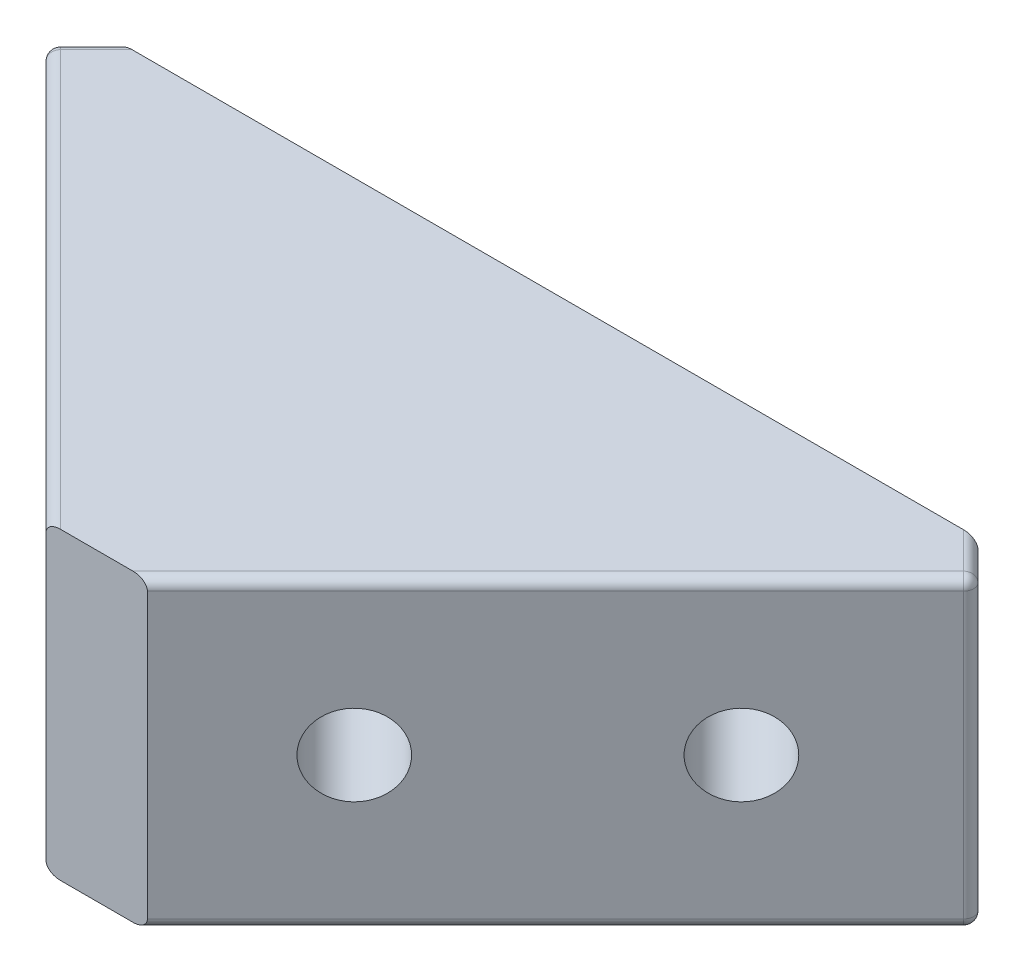
ISO-10303-21;
HEADER;
FILE_DESCRIPTION(('STEP AP214'),'2;1');
FILE_NAME('part.step','',(''),(''),'','','');
FILE_SCHEMA(('AUTOMOTIVE_DESIGN { 1 0 10303 214 1 1 1 1 }'));
ENDSEC;
DATA;
#1=APPLICATION_CONTEXT('core data for automotive mechanical design processes');
#2=APPLICATION_PROTOCOL_DEFINITION('international standard','automotive_design',2000,#1);
#3=PRODUCT_CONTEXT('',#1,'mechanical');
#4=PRODUCT('Part','Part','',(#3));
#5=PRODUCT_RELATED_PRODUCT_CATEGORY('part','',(#4));
#6=PRODUCT_DEFINITION_FORMATION('','',#4);
#7=PRODUCT_DEFINITION_CONTEXT('part definition',#1,'design');
#8=PRODUCT_DEFINITION('design','',#6,#7);
#9=PRODUCT_DEFINITION_SHAPE('','',#8);
#10=(LENGTH_UNIT() NAMED_UNIT(*) SI_UNIT(.MILLI.,.METRE.));
#11=(NAMED_UNIT(*) PLANE_ANGLE_UNIT() SI_UNIT($,.RADIAN.));
#12=(NAMED_UNIT(*) SI_UNIT($,.STERADIAN.) SOLID_ANGLE_UNIT());
#13=UNCERTAINTY_MEASURE_WITH_UNIT(LENGTH_MEASURE(1.E-05),#10,'distance_accuracy_value','');
#14=(GEOMETRIC_REPRESENTATION_CONTEXT(3) GLOBAL_UNCERTAINTY_ASSIGNED_CONTEXT((#13)) GLOBAL_UNIT_ASSIGNED_CONTEXT((#10,
#11,#12)) REPRESENTATION_CONTEXT('',''));
#15=CARTESIAN_POINT('',(0.,0.,0.));
#16=DIRECTION('',(0.,0.,1.));
#17=DIRECTION('',(1.,0.,0.));
#18=AXIS2_PLACEMENT_3D('',#15,#16,#17);
#19=CARTESIAN_POINT('',(17.9956890143242,7.5,-8.44974746830585));
#20=DIRECTION('',(-0.707106781186548,0.,0.707106781186547));
#21=DIRECTION('',(0.707106781186547,0.,0.707106781186548));
#22=AXIS2_PLACEMENT_3D('',#19,#20,#21);
#23=CYLINDRICAL_SURFACE('',#22,3.5);
#24=CARTESIAN_POINT('',(-3.3587572106361,7.5,12.9046987566545));
#25=DIRECTION('',(-0.707106781186548,0.,0.707106781186547));
#26=DIRECTION('',(0.707106781186547,0.,0.707106781186548));
#27=AXIS2_PLACEMENT_3D('',#24,#25,#26);
#28=CIRCLE('',#27,3.5);
#29=CARTESIAN_POINT('',(-0.883883476483179,7.5,15.3795724908074));
#30=VERTEX_POINT('',#29);
#31=EDGE_CURVE('E313',#30,#30,#28,.T.);
#32=ORIENTED_EDGE('',*,*,#31,.T.);
#33=EDGE_LOOP('',(#32));
#34=FACE_BOUND('',#33,.T.);
#35=CARTESIAN_POINT('',(0.,7.5,9.5459415460184));
#36=DIRECTION('',(-1.,0.,0.));
#37=DIRECTION('',(0.,0.,1.));
#38=AXIS2_PLACEMENT_3D('',#35,#36,#37);
#39=ELLIPSE('',#38,4.94974746830583,3.5);
#40=CARTESIAN_POINT('',(0.,11.,9.5459415460184));
#41=VERTEX_POINT('',#40);
#42=CARTESIAN_POINT('',(0.,4.,9.5459415460184));
#43=VERTEX_POINT('',#42);
#44=EDGE_CURVE('E51',#41,#43,#39,.F.);
#45=ORIENTED_EDGE('',*,*,#44,.T.);
#46=CARTESIAN_POINT('',(0.,7.5,9.5459415460184));
#47=DIRECTION('',(0.,0.,1.));
#48=DIRECTION('',(-1.,0.,0.));
#49=AXIS2_PLACEMENT_3D('',#46,#47,#48);
#50=ELLIPSE('',#49,4.94974746830584,3.5);
#51=EDGE_CURVE('E309',#43,#41,#50,.F.);
#52=ORIENTED_EDGE('',*,*,#51,.T.);
#53=EDGE_LOOP('',(#45,#52));
#54=FACE_BOUND('',#53,.T.);
#55=ADVANCED_FACE('F35',(#34,#54),#23,.F.);
#56=CARTESIAN_POINT('',(-14.3743686707646,7.5,-4.82842712474619));
#57=DIRECTION('',(0.707106781186548,0.,0.707106781186547));
#58=DIRECTION('',(0.707106781186547,0.,-0.707106781186548));
#59=AXIS2_PLACEMENT_3D('',#56,#57,#58);
#60=CYLINDRICAL_SURFACE('',#59,2.);
#61=CARTESIAN_POINT('',(3.35875721063609,7.5,12.9046987566545));
#62=DIRECTION('',(0.707106781186548,0.,0.707106781186547));
#63=DIRECTION('',(0.707106781186547,0.,-0.707106781186548));
#64=AXIS2_PLACEMENT_3D('',#61,#62,#63);
#65=CIRCLE('',#64,2.);
#66=CARTESIAN_POINT('',(4.77297077300919,7.5,11.4904851942814));
#67=VERTEX_POINT('',#66);
#68=EDGE_CURVE('E39',#67,#67,#65,.F.);
#69=ORIENTED_EDGE('',*,*,#68,.T.);
#70=EDGE_LOOP('',(#69));
#71=FACE_BOUND('',#70,.T.);
#72=CARTESIAN_POINT('',(7.60139789775538,7.5,17.1473394437738));
#73=DIRECTION('',(0.707106781186548,0.,0.707106781186547));
#74=DIRECTION('',(0.707106781186547,0.,-0.707106781186548));
#75=AXIS2_PLACEMENT_3D('',#72,#73,#74);
#76=CIRCLE('',#75,2.);
#77=CARTESIAN_POINT('',(9.01561146012848,7.5,15.7331258814007));
#78=VERTEX_POINT('',#77);
#79=EDGE_CURVE('E204',#78,#78,#76,.T.);
#80=ORIENTED_EDGE('',*,*,#79,.T.);
#81=EDGE_LOOP('',(#80));
#82=FACE_BOUND('',#81,.T.);
#83=ADVANCED_FACE('F345',(#71,#82),#60,.F.);
#84=CARTESIAN_POINT('',(0.,15.,24.7487373415292));
#85=DIRECTION('',(0.707106781186547,0.,-0.707106781186547));
#86=DIRECTION('',(-0.707106781186548,0.,-0.707106781186548));
#87=AXIS2_PLACEMENT_3D('',#84,#85,#86);
#88=PLANE('',#87);
#89=CARTESIAN_POINT('',(-7.60139789775539,7.5,17.1473394437738));
#90=DIRECTION('',(-0.707106781186548,0.,0.707106781186547));
#91=DIRECTION('',(0.707106781186547,0.,0.707106781186548));
#92=AXIS2_PLACEMENT_3D('',#89,#90,#91);
#93=CIRCLE('',#92,2.);
#94=CARTESIAN_POINT('',(-6.1871843353823,7.5,18.5615530061469));
#95=VERTEX_POINT('',#94);
#96=EDGE_CURVE('E187',#95,#95,#93,.T.);
#97=ORIENTED_EDGE('',*,*,#96,.F.);
#98=EDGE_LOOP('',(#97));
#99=FACE_BOUND('',#98,.T.);
#100=CARTESIAN_POINT('',(-17.1473394437738,7.5,7.60139789775539));
#101=DIRECTION('',(-0.707106781186548,0.,0.707106781186547));
#102=DIRECTION('',(0.707106781186547,0.,0.707106781186548));
#103=AXIS2_PLACEMENT_3D('',#100,#101,#102);
#104=CIRCLE('',#103,2.);
#105=CARTESIAN_POINT('',(-15.7331258814007,7.5,9.01561146012848));
#106=VERTEX_POINT('',#105);
#107=EDGE_CURVE('E198',#106,#106,#104,.T.);
#108=ORIENTED_EDGE('',*,*,#107,.F.);
#109=EDGE_LOOP('',(#108));
#110=FACE_BOUND('',#109,.T.);
#111=DIRECTION('',(0.,-1.,0.));
#112=VECTOR('',#111,1.);
#113=CARTESIAN_POINT('',(-2.49999999999999,15.001,22.2487373415292));
#114=LINE('',#113,#112);
#115=CARTESIAN_POINT('',(-2.49999999999999,14.5,22.2487373415292));
#116=VERTEX_POINT('',#115);
#117=CARTESIAN_POINT('',(-2.49999999999999,0.500000000000004,22.2487373415292));
#118=VERTEX_POINT('',#117);
#119=EDGE_CURVE('E184',#116,#118,#114,.T.);
#120=ORIENTED_EDGE('',*,*,#119,.F.);
#121=DIRECTION('',(0.707106781186548,0.,0.707106781186548));
#122=VECTOR('',#121,1.);
#123=CARTESIAN_POINT('',(-22.9809703885628,14.5,1.76776695296636));
#124=LINE('',#123,#122);
#125=CARTESIAN_POINT('',(-22.6274169979695,14.5,2.12132034355964));
#126=VERTEX_POINT('',#125);
#127=EDGE_CURVE('E231',#116,#126,#124,.F.);
#128=ORIENTED_EDGE('',*,*,#127,.T.);
#129=DIRECTION('',(0.,-1.,0.));
#130=VECTOR('',#129,1.);
#131=CARTESIAN_POINT('',(-22.6274169979695,15.,2.12132034355964));
#132=LINE('',#131,#130);
#133=CARTESIAN_POINT('',(-22.6274169979695,0.5,2.12132034355964));
#134=VERTEX_POINT('',#133);
#135=EDGE_CURVE('E228',#126,#134,#132,.T.);
#136=ORIENTED_EDGE('',*,*,#135,.T.);
#137=DIRECTION('',(0.707106781186548,0.,0.707106781186548));
#138=VECTOR('',#137,1.);
#139=CARTESIAN_POINT('',(0.,0.5,24.7487373415292));
#140=LINE('',#139,#138);
#141=EDGE_CURVE('E226',#134,#118,#140,.T.);
#142=ORIENTED_EDGE('',*,*,#141,.T.);
#143=EDGE_LOOP('',(#120,#128,#136,#142));
#144=FACE_BOUND('',#143,.T.);
#145=ADVANCED_FACE('F340',(#99,#110,#144),#88,.F.);
#146=CARTESIAN_POINT('',(24.7487373415292,15.,0.));
#147=DIRECTION('',(-0.707106781186548,0.,-0.707106781186547));
#148=DIRECTION('',(-0.707106781186547,0.,0.707106781186548));
#149=AXIS2_PLACEMENT_3D('',#146,#147,#148);
#150=PLANE('',#149);
#151=CARTESIAN_POINT('',(17.1473394437738,7.5,7.60139789775538));
#152=DIRECTION('',(0.707106781186548,0.,0.707106781186547));
#153=DIRECTION('',(0.707106781186547,0.,-0.707106781186548));
#154=AXIS2_PLACEMENT_3D('',#151,#152,#153);
#155=CIRCLE('',#154,2.);
#156=CARTESIAN_POINT('',(18.5615530061469,7.5,6.18718433538228));
#157=VERTEX_POINT('',#156);
#158=EDGE_CURVE('E201',#157,#157,#155,.T.);
#159=ORIENTED_EDGE('',*,*,#158,.F.);
#160=EDGE_LOOP('',(#159));
#161=FACE_BOUND('',#160,.T.);
#162=ORIENTED_EDGE('',*,*,#79,.F.);
#163=EDGE_LOOP('',(#162));
#164=FACE_BOUND('',#163,.T.);
#165=DIRECTION('',(0.,-1.,0.));
#166=VECTOR('',#165,1.);
#167=CARTESIAN_POINT('',(2.5,15.001,22.2487373415292));
#168=LINE('',#167,#166);
#169=CARTESIAN_POINT('',(2.5,14.5,22.2487373415292));
#170=VERTEX_POINT('',#169);
#171=CARTESIAN_POINT('',(2.5,0.500000000000004,22.2487373415292));
#172=VERTEX_POINT('',#171);
#173=EDGE_CURVE('E183',#170,#172,#168,.T.);
#174=ORIENTED_EDGE('',*,*,#173,.T.);
#175=DIRECTION('',(0.707106781186547,0.,-0.707106781186548));
#176=VECTOR('',#175,1.);
#177=CARTESIAN_POINT('',(24.7487373415292,0.5,0.));
#178=LINE('',#177,#176);
#179=CARTESIAN_POINT('',(22.6274169979695,0.5,2.12132034355963));
#180=VERTEX_POINT('',#179);
#181=EDGE_CURVE('E224',#172,#180,#178,.T.);
#182=ORIENTED_EDGE('',*,*,#181,.T.);
#183=DIRECTION('',(0.,-1.,0.));
#184=VECTOR('',#183,1.);
#185=CARTESIAN_POINT('',(22.6274169979695,15.,2.12132034355963));
#186=LINE('',#185,#184);
#187=CARTESIAN_POINT('',(22.6274169979695,14.5,2.12132034355963));
#188=VERTEX_POINT('',#187);
#189=EDGE_CURVE('E222',#180,#188,#186,.F.);
#190=ORIENTED_EDGE('',*,*,#189,.T.);
#191=DIRECTION('',(0.707106781186547,0.,-0.707106781186548));
#192=VECTOR('',#191,1.);
#193=CARTESIAN_POINT('',(2.5,14.5,22.2487373415292));
#194=LINE('',#193,#192);
#195=EDGE_CURVE('E220',#188,#170,#194,.F.);
#196=ORIENTED_EDGE('',*,*,#195,.T.);
#197=EDGE_LOOP('',(#174,#182,#190,#196));
#198=FACE_BOUND('',#197,.T.);
#199=ADVANCED_FACE('F331',(#161,#164,#198),#150,.F.);
#200=CARTESIAN_POINT('',(-24.7487373415292,15.,0.));
#201=DIRECTION('',(0.,0.,1.));
#202=DIRECTION('',(1.,0.,0.));
#203=AXIS2_PLACEMENT_3D('',#200,#201,#202);
#204=PLANE('',#203);
#205=CARTESIAN_POINT('',(9.54594154601841,7.5,0.));
#206=DIRECTION('',(0.,0.,1.));
#207=DIRECTION('',(-1.,0.,0.));
#208=AXIS2_PLACEMENT_3D('',#205,#206,#207);
#209=ELLIPSE('',#208,4.94974746830584,3.5);
#210=CARTESIAN_POINT('',(9.5459415460184,11.,0.));
#211=VERTEX_POINT('',#210);
#212=CARTESIAN_POINT('',(9.54594154601839,3.99999999999999,0.));
#213=VERTEX_POINT('',#212);
#214=EDGE_CURVE('E172',#211,#213,#209,.F.);
#215=ORIENTED_EDGE('',*,*,#214,.F.);
#216=EDGE_CURVE('E323',#213,#211,#209,.F.);
#217=ORIENTED_EDGE('',*,*,#216,.F.);
#218=EDGE_LOOP('',(#215,#217));
#219=FACE_BOUND('',#218,.T.);
#220=CARTESIAN_POINT('',(-9.54594154601837,7.5,0.));
#221=DIRECTION('',(0.,0.,1.));
#222=DIRECTION('',(-1.,0.,0.));
#223=AXIS2_PLACEMENT_3D('',#220,#221,#222);
#224=ELLIPSE('',#223,4.94974746830584,3.5);
#225=CARTESIAN_POINT('',(-9.5459415460184,11.,0.));
#226=VERTEX_POINT('',#225);
#227=CARTESIAN_POINT('',(-9.5459415460184,4.,0.));
#228=VERTEX_POINT('',#227);
#229=EDGE_CURVE('E154',#226,#228,#224,.F.);
#230=ORIENTED_EDGE('',*,*,#229,.F.);
#231=EDGE_CURVE('E162',#228,#226,#224,.F.);
#232=ORIENTED_EDGE('',*,*,#231,.F.);
#233=EDGE_LOOP('',(#230,#232));
#234=FACE_BOUND('',#233,.T.);
#235=DIRECTION('',(0.,-1.,0.));
#236=VECTOR('',#235,1.);
#237=CARTESIAN_POINT('',(-21.2132034355964,15.001,0.));
#238=LINE('',#237,#236);
#239=CARTESIAN_POINT('',(-21.2132034355964,14.5,0.));
#240=VERTEX_POINT('',#239);
#241=CARTESIAN_POINT('',(-21.2132034355964,0.500000000000004,0.));
#242=VERTEX_POINT('',#241);
#243=EDGE_CURVE('E192',#240,#242,#238,.T.);
#244=ORIENTED_EDGE('',*,*,#243,.F.);
#245=CARTESIAN_POINT('',(-20.5060966544099,14.5,0.));
#246=DIRECTION('',(0.,0.,1.));
#247=DIRECTION('',(1.,0.,0.));
#248=AXIS2_PLACEMENT_3D('',#245,#246,#247);
#249=ELLIPSE('',#248,0.707106781186548,0.5);
#250=CARTESIAN_POINT('',(-20.5060966544099,15.,0.));
#251=VERTEX_POINT('',#250);
#252=EDGE_CURVE('E261',#240,#251,#249,.F.);
#253=ORIENTED_EDGE('',*,*,#252,.T.);
#254=DIRECTION('',(-1.,0.,0.));
#255=VECTOR('',#254,1.);
#256=CARTESIAN_POINT('',(-24.7487373415292,15.,0.));
#257=LINE('',#256,#255);
#258=CARTESIAN_POINT('',(20.5060966544099,15.,0.));
#259=VERTEX_POINT('',#258);
#260=EDGE_CURVE('E208',#259,#251,#257,.T.);
#261=ORIENTED_EDGE('',*,*,#260,.F.);
#262=CARTESIAN_POINT('',(20.5060966544099,14.5,0.));
#263=DIRECTION('',(0.,0.,1.));
#264=DIRECTION('',(1.,0.,0.));
#265=AXIS2_PLACEMENT_3D('',#262,#263,#264);
#266=ELLIPSE('',#265,0.707106781186548,0.5);
#267=CARTESIAN_POINT('',(21.2132034355964,14.5,0.));
#268=VERTEX_POINT('',#267);
#269=EDGE_CURVE('E259',#259,#268,#266,.F.);
#270=ORIENTED_EDGE('',*,*,#269,.T.);
#271=DIRECTION('',(0.,-1.,0.));
#272=VECTOR('',#271,1.);
#273=CARTESIAN_POINT('',(21.2132034355964,15.001,0.));
#274=LINE('',#273,#272);
#275=CARTESIAN_POINT('',(21.2132034355964,0.500000000000004,0.));
#276=VERTEX_POINT('',#275);
#277=EDGE_CURVE('E180',#268,#276,#274,.T.);
#278=ORIENTED_EDGE('',*,*,#277,.T.);
#279=CARTESIAN_POINT('',(20.5060966544099,0.5,0.));
#280=DIRECTION('',(0.,0.,1.));
#281=DIRECTION('',(-1.,0.,0.));
#282=AXIS2_PLACEMENT_3D('',#279,#280,#281);
#283=ELLIPSE('',#282,0.707106781186548,0.5);
#284=CARTESIAN_POINT('',(20.5060966544099,0.,0.));
#285=VERTEX_POINT('',#284);
#286=EDGE_CURVE('E255',#276,#285,#283,.F.);
#287=ORIENTED_EDGE('',*,*,#286,.T.);
#288=DIRECTION('',(-1.,0.,0.));
#289=VECTOR('',#288,1.);
#290=CARTESIAN_POINT('',(-24.7487373415292,0.,0.));
#291=LINE('',#290,#289);
#292=CARTESIAN_POINT('',(-20.5060966544099,0.,0.));
#293=VERTEX_POINT('',#292);
#294=EDGE_CURVE('E207',#285,#293,#291,.T.);
#295=ORIENTED_EDGE('',*,*,#294,.T.);
#296=CARTESIAN_POINT('',(-20.5060966544099,0.5,0.));
#297=DIRECTION('',(0.,0.,1.));
#298=DIRECTION('',(-1.,0.,0.));
#299=AXIS2_PLACEMENT_3D('',#296,#297,#298);
#300=ELLIPSE('',#299,0.707106781186548,0.5);
#301=EDGE_CURVE('E257',#293,#242,#300,.F.);
#302=ORIENTED_EDGE('',*,*,#301,.T.);
#303=EDGE_LOOP('',(#244,#253,#261,#270,#278,#287,#295,#302));
#304=FACE_BOUND('',#303,.T.);
#305=ADVANCED_FACE('F168',(#219,#234,#304),#204,.F.);
#306=CARTESIAN_POINT('',(0.,15.,0.));
#307=DIRECTION('',(0.,1.,0.));
#308=DIRECTION('',(0.,0.,1.));
#309=AXIS2_PLACEMENT_3D('',#306,#307,#308);
#310=PLANE('',#309);
#311=DIRECTION('',(-0.707106781186548,0.,0.707106781186547));
#312=VECTOR('',#311,1.);
#313=CARTESIAN_POINT('',(-22.6274169979695,15.,2.12132034355964));
#314=LINE('',#313,#312);
#315=CARTESIAN_POINT('',(-22.2738636073762,15.,1.76776695296637));
#316=VERTEX_POINT('',#315);
#317=EDGE_CURVE('E243',#251,#316,#314,.T.);
#318=ORIENTED_EDGE('',*,*,#317,.T.);
#319=DIRECTION('',(0.707106781186548,0.,0.707106781186548));
#320=VECTOR('',#319,1.);
#321=CARTESIAN_POINT('',(-2.14644660940672,15.,21.8951839509359));
#322=LINE('',#321,#320);
#323=CARTESIAN_POINT('',(-1.79289321881345,15.,22.2487373415292));
#324=VERTEX_POINT('',#323);
#325=EDGE_CURVE('E245',#316,#324,#322,.T.);
#326=ORIENTED_EDGE('',*,*,#325,.T.);
#327=DIRECTION('',(1.,0.,0.));
#328=VECTOR('',#327,1.);
#329=CARTESIAN_POINT('',(2.5,15.,22.2487373415292));
#330=LINE('',#329,#328);
#331=CARTESIAN_POINT('',(1.79289321881345,15.,22.2487373415292));
#332=VERTEX_POINT('',#331);
#333=EDGE_CURVE('E176',#324,#332,#330,.T.);
#334=ORIENTED_EDGE('',*,*,#333,.T.);
#335=DIRECTION('',(0.707106781186547,0.,-0.707106781186548));
#336=VECTOR('',#335,1.);
#337=CARTESIAN_POINT('',(22.6274169979695,15.,1.41421356237309));
#338=LINE('',#337,#336);
#339=CARTESIAN_POINT('',(22.2738636073762,15.,1.76776695296636));
#340=VERTEX_POINT('',#339);
#341=EDGE_CURVE('E241',#332,#340,#338,.T.);
#342=ORIENTED_EDGE('',*,*,#341,.T.);
#343=DIRECTION('',(-0.707106781186548,0.,-0.707106781186547));
#344=VECTOR('',#343,1.);
#345=CARTESIAN_POINT('',(20.8596500450032,15.,0.353553390593274));
#346=LINE('',#345,#344);
#347=EDGE_CURVE('E239',#340,#259,#346,.T.);
#348=ORIENTED_EDGE('',*,*,#347,.T.);
#349=ORIENTED_EDGE('',*,*,#260,.T.);
#350=EDGE_LOOP('',(#318,#326,#334,#342,#348,#349));
#351=FACE_BOUND('',#350,.T.);
#352=ADVANCED_FACE('F330',(#351),#310,.T.);
#353=CARTESIAN_POINT('',(0.,0.,0.));
#354=DIRECTION('',(0.,1.,0.));
#355=DIRECTION('',(0.,0.,1.));
#356=AXIS2_PLACEMENT_3D('',#353,#354,#355);
#357=PLANE('',#356);
#358=DIRECTION('',(1.,0.,0.));
#359=VECTOR('',#358,1.);
#360=CARTESIAN_POINT('',(2.5,0.,22.2487373415292));
#361=LINE('',#360,#359);
#362=CARTESIAN_POINT('',(-1.79289321881345,0.,22.2487373415292));
#363=VERTEX_POINT('',#362);
#364=CARTESIAN_POINT('',(1.79289321881345,0.,22.2487373415292));
#365=VERTEX_POINT('',#364);
#366=EDGE_CURVE('E179',#363,#365,#361,.T.);
#367=ORIENTED_EDGE('',*,*,#366,.F.);
#368=DIRECTION('',(0.707106781186548,0.,0.707106781186548));
#369=VECTOR('',#368,1.);
#370=CARTESIAN_POINT('',(-12.0208152801713,0.,12.0208152801713));
#371=LINE('',#370,#369);
#372=CARTESIAN_POINT('',(-22.2738636073762,0.,1.76776695296637));
#373=VERTEX_POINT('',#372);
#374=EDGE_CURVE('E166',#363,#373,#371,.F.);
#375=ORIENTED_EDGE('',*,*,#374,.T.);
#376=DIRECTION('',(-0.707106781186548,0.,0.707106781186547));
#377=VECTOR('',#376,1.);
#378=CARTESIAN_POINT('',(-10.2530483272049,0.,-10.2530483272049));
#379=LINE('',#378,#377);
#380=EDGE_CURVE('E267',#373,#293,#379,.F.);
#381=ORIENTED_EDGE('',*,*,#380,.T.);
#382=ORIENTED_EDGE('',*,*,#294,.F.);
#383=DIRECTION('',(-0.707106781186548,0.,-0.707106781186547));
#384=VECTOR('',#383,1.);
#385=CARTESIAN_POINT('',(10.2530483272049,0.,-10.2530483272049));
#386=LINE('',#385,#384);
#387=CARTESIAN_POINT('',(22.2738636073762,0.,1.76776695296636));
#388=VERTEX_POINT('',#387);
#389=EDGE_CURVE('E263',#285,#388,#386,.F.);
#390=ORIENTED_EDGE('',*,*,#389,.T.);
#391=DIRECTION('',(0.707106781186547,0.,-0.707106781186548));
#392=VECTOR('',#391,1.);
#393=CARTESIAN_POINT('',(12.0208152801713,0.,12.0208152801713));
#394=LINE('',#393,#392);
#395=EDGE_CURVE('E265',#388,#365,#394,.F.);
#396=ORIENTED_EDGE('',*,*,#395,.T.);
#397=EDGE_LOOP('',(#367,#375,#381,#382,#390,#396));
#398=FACE_BOUND('',#397,.T.);
#399=ADVANCED_FACE('F337',(#398),#357,.F.);
#400=CARTESIAN_POINT('',(-4.82842712474621,7.5,-14.3743686707646));
#401=DIRECTION('',(0.707106781186548,0.,0.707106781186547));
#402=DIRECTION('',(0.707106781186547,0.,-0.707106781186548));
#403=AXIS2_PLACEMENT_3D('',#400,#401,#402);
#404=CYLINDRICAL_SURFACE('',#403,2.);
#405=CARTESIAN_POINT('',(12.9046987566545,7.5,3.35875721063609));
#406=DIRECTION('',(0.707106781186548,0.,0.707106781186547));
#407=DIRECTION('',(0.707106781186547,0.,-0.707106781186548));
#408=AXIS2_PLACEMENT_3D('',#405,#406,#407);
#409=CIRCLE('',#408,2.);
#410=CARTESIAN_POINT('',(14.3189123190276,7.5,1.94454364826299));
#411=VERTEX_POINT('',#410);
#412=EDGE_CURVE('E307',#411,#411,#409,.F.);
#413=ORIENTED_EDGE('',*,*,#412,.T.);
#414=EDGE_LOOP('',(#413));
#415=FACE_BOUND('',#414,.T.);
#416=ORIENTED_EDGE('',*,*,#158,.T.);
#417=EDGE_LOOP('',(#416));
#418=FACE_BOUND('',#417,.T.);
#419=ADVANCED_FACE('F521',(#415,#418),#404,.F.);
#420=CARTESIAN_POINT('',(4.82842712474621,7.5,-14.3743686707646));
#421=DIRECTION('',(-0.707106781186548,0.,0.707106781186547));
#422=DIRECTION('',(0.707106781186547,0.,0.707106781186548));
#423=AXIS2_PLACEMENT_3D('',#420,#421,#422);
#424=CYLINDRICAL_SURFACE('',#423,2.);
#425=CARTESIAN_POINT('',(-12.9046987566545,7.5,3.3587572106361));
#426=DIRECTION('',(-0.707106781186548,0.,0.707106781186547));
#427=DIRECTION('',(0.707106781186547,0.,0.707106781186548));
#428=AXIS2_PLACEMENT_3D('',#425,#426,#427);
#429=CIRCLE('',#428,2.);
#430=CARTESIAN_POINT('',(-11.4904851942814,7.5,4.7729707730092));
#431=VERTEX_POINT('',#430);
#432=EDGE_CURVE('E290',#431,#431,#429,.F.);
#433=ORIENTED_EDGE('',*,*,#432,.T.);
#434=EDGE_LOOP('',(#433));
#435=FACE_BOUND('',#434,.T.);
#436=ORIENTED_EDGE('',*,*,#107,.T.);
#437=EDGE_LOOP('',(#436));
#438=FACE_BOUND('',#437,.T.);
#439=ADVANCED_FACE('F517',(#435,#438),#424,.F.);
#440=CARTESIAN_POINT('',(14.3743686707646,7.5,-4.82842712474619));
#441=DIRECTION('',(-0.707106781186548,0.,0.707106781186547));
#442=DIRECTION('',(0.707106781186547,0.,0.707106781186548));
#443=AXIS2_PLACEMENT_3D('',#440,#441,#442);
#444=CYLINDRICAL_SURFACE('',#443,2.);
#445=CARTESIAN_POINT('',(-3.3587572106361,7.5,12.9046987566545));
#446=DIRECTION('',(-0.707106781186548,0.,0.707106781186547));
#447=DIRECTION('',(0.707106781186547,0.,0.707106781186548));
#448=AXIS2_PLACEMENT_3D('',#445,#446,#447);
#449=CIRCLE('',#448,2.);
#450=CARTESIAN_POINT('',(-1.94454364826301,7.5,14.3189123190276));
#451=VERTEX_POINT('',#450);
#452=EDGE_CURVE('E161',#451,#451,#449,.F.);
#453=ORIENTED_EDGE('',*,*,#452,.T.);
#454=EDGE_LOOP('',(#453));
#455=FACE_BOUND('',#454,.T.);
#456=ORIENTED_EDGE('',*,*,#96,.T.);
#457=EDGE_LOOP('',(#456));
#458=FACE_BOUND('',#457,.T.);
#459=ADVANCED_FACE('F514',(#455,#458),#444,.F.);
#460=CARTESIAN_POINT('',(-22.9809703885628,15.001,1.76776695296636));
#461=DIRECTION('',(0.707106781186547,0.,0.707106781186548));
#462=DIRECTION('',(0.707106781186548,0.,-0.707106781186547));
#463=AXIS2_PLACEMENT_3D('',#460,#461,#462);
#464=PLANE('',#463);
#465=DIRECTION('',(0.,-1.,0.));
#466=VECTOR('',#465,1.);
#467=CARTESIAN_POINT('',(-22.6274169979695,15.001,1.41421356237309));
#468=LINE('',#467,#466);
#469=CARTESIAN_POINT('',(-22.6274169979695,0.5,1.41421356237309));
#470=VERTEX_POINT('',#469);
#471=CARTESIAN_POINT('',(-22.6274169979695,14.5,1.41421356237309));
#472=VERTEX_POINT('',#471);
#473=EDGE_CURVE('E235',#470,#472,#468,.F.);
#474=ORIENTED_EDGE('',*,*,#473,.T.);
#475=DIRECTION('',(-0.707106781186548,0.,0.707106781186547));
#476=VECTOR('',#475,1.);
#477=CARTESIAN_POINT('',(-21.2132034355964,14.5,0.));
#478=LINE('',#477,#476);
#479=EDGE_CURVE('E237',#472,#240,#478,.F.);
#480=ORIENTED_EDGE('',*,*,#479,.T.);
#481=ORIENTED_EDGE('',*,*,#243,.T.);
#482=DIRECTION('',(-0.707106781186548,0.,0.707106781186547));
#483=VECTOR('',#482,1.);
#484=CARTESIAN_POINT('',(-22.9809703885628,0.5,1.76776695296636));
#485=LINE('',#484,#483);
#486=EDGE_CURVE('E233',#242,#470,#485,.T.);
#487=ORIENTED_EDGE('',*,*,#486,.T.);
#488=EDGE_LOOP('',(#474,#480,#481,#487));
#489=FACE_BOUND('',#488,.T.);
#490=ADVANCED_FACE('F467',(#489),#464,.F.);
#491=CARTESIAN_POINT('',(21.2132034355964,15.001,0.));
#492=DIRECTION('',(-0.707106781186547,0.,0.707106781186548));
#493=DIRECTION('',(0.707106781186548,0.,0.707106781186547));
#494=AXIS2_PLACEMENT_3D('',#491,#492,#493);
#495=PLANE('',#494);
#496=ORIENTED_EDGE('',*,*,#277,.F.);
#497=DIRECTION('',(-0.707106781186548,0.,-0.707106781186547));
#498=VECTOR('',#497,1.);
#499=CARTESIAN_POINT('',(22.9809703885628,14.5,1.76776695296636));
#500=LINE('',#499,#498);
#501=CARTESIAN_POINT('',(22.6274169979695,14.5,1.41421356237309));
#502=VERTEX_POINT('',#501);
#503=EDGE_CURVE('E218',#268,#502,#500,.F.);
#504=ORIENTED_EDGE('',*,*,#503,.T.);
#505=DIRECTION('',(0.,-1.,0.));
#506=VECTOR('',#505,1.);
#507=CARTESIAN_POINT('',(22.6274169979695,15.001,1.41421356237309));
#508=LINE('',#507,#506);
#509=CARTESIAN_POINT('',(22.6274169979695,0.5,1.41421356237309));
#510=VERTEX_POINT('',#509);
#511=EDGE_CURVE('E215',#502,#510,#508,.T.);
#512=ORIENTED_EDGE('',*,*,#511,.T.);
#513=DIRECTION('',(-0.707106781186548,0.,-0.707106781186547));
#514=VECTOR('',#513,1.);
#515=CARTESIAN_POINT('',(21.2132034355964,0.5,0.));
#516=LINE('',#515,#514);
#517=EDGE_CURVE('E211',#510,#276,#516,.T.);
#518=ORIENTED_EDGE('',*,*,#517,.T.);
#519=EDGE_LOOP('',(#496,#504,#512,#518));
#520=FACE_BOUND('',#519,.T.);
#521=ADVANCED_FACE('F416',(#520),#495,.F.);
#522=CARTESIAN_POINT('',(2.5,15.001,22.2487373415292));
#523=DIRECTION('',(0.,0.,-1.));
#524=DIRECTION('',(-1.,0.,0.));
#525=AXIS2_PLACEMENT_3D('',#522,#523,#524);
#526=PLANE('',#525);
#527=ORIENTED_EDGE('',*,*,#333,.F.);
#528=CARTESIAN_POINT('',(-1.79289321881345,14.5,22.2487373415292));
#529=DIRECTION('',(0.,0.,-1.));
#530=DIRECTION('',(-1.,0.,0.));
#531=AXIS2_PLACEMENT_3D('',#528,#529,#530);
#532=ELLIPSE('',#531,0.707106781186548,0.5);
#533=EDGE_CURVE('E253',#324,#116,#532,.F.);
#534=ORIENTED_EDGE('',*,*,#533,.T.);
#535=ORIENTED_EDGE('',*,*,#119,.T.);
#536=CARTESIAN_POINT('',(-1.79289321881345,0.5,22.2487373415292));
#537=DIRECTION('',(0.,0.,-1.));
#538=DIRECTION('',(1.,0.,0.));
#539=AXIS2_PLACEMENT_3D('',#536,#537,#538);
#540=ELLIPSE('',#539,0.707106781186548,0.5);
#541=EDGE_CURVE('E251',#118,#363,#540,.F.);
#542=ORIENTED_EDGE('',*,*,#541,.T.);
#543=ORIENTED_EDGE('',*,*,#366,.T.);
#544=CARTESIAN_POINT('',(1.79289321881345,0.5,22.2487373415292));
#545=DIRECTION('',(0.,0.,-1.));
#546=DIRECTION('',(1.,0.,0.));
#547=AXIS2_PLACEMENT_3D('',#544,#545,#546);
#548=ELLIPSE('',#547,0.707106781186547,0.5);
#549=EDGE_CURVE('E249',#365,#172,#548,.F.);
#550=ORIENTED_EDGE('',*,*,#549,.T.);
#551=ORIENTED_EDGE('',*,*,#173,.F.);
#552=CARTESIAN_POINT('',(1.79289321881345,14.5,22.2487373415292));
#553=DIRECTION('',(0.,0.,-1.));
#554=DIRECTION('',(-1.,0.,0.));
#555=AXIS2_PLACEMENT_3D('',#552,#553,#554);
#556=ELLIPSE('',#555,0.707106781186547,0.5);
#557=EDGE_CURVE('E247',#170,#332,#556,.F.);
#558=ORIENTED_EDGE('',*,*,#557,.T.);
#559=EDGE_LOOP('',(#527,#534,#535,#542,#543,#550,#551,#558));
#560=FACE_BOUND('',#559,.T.);
#561=ADVANCED_FACE('F430',(#560),#526,.F.);
#562=CARTESIAN_POINT('',(12.0208152801713,14.5,12.0208152801713));
#563=DIRECTION('',(-0.707106781186547,0.,0.707106781186548));
#564=DIRECTION('',(0.707106781186548,0.,0.707106781186547));
#565=AXIS2_PLACEMENT_3D('',#562,#563,#564);
#566=CYLINDRICAL_SURFACE('',#565,0.5);
#567=ORIENTED_EDGE('',*,*,#557,.F.);
#568=ORIENTED_EDGE('',*,*,#195,.F.);
#569=CARTESIAN_POINT('',(22.2738636073762,14.5,1.76776695296636));
#570=DIRECTION('',(0.707106781186547,0.,-0.707106781186547));
#571=DIRECTION('',(-0.707106781186548,0.,-0.707106781186548));
#572=AXIS2_PLACEMENT_3D('',#569,#570,#571);
#573=CIRCLE('',#572,0.5);
#574=EDGE_CURVE('E195',#340,#188,#573,.T.);
#575=ORIENTED_EDGE('',*,*,#574,.F.);
#576=ORIENTED_EDGE('',*,*,#341,.F.);
#577=EDGE_LOOP('',(#567,#568,#575,#576));
#578=FACE_BOUND('',#577,.T.);
#579=ADVANCED_FACE('F428',(#578),#566,.T.);
#580=CARTESIAN_POINT('',(10.2530483272049,14.5,-10.2530483272049));
#581=DIRECTION('',(0.707106781186548,0.,0.707106781186547));
#582=DIRECTION('',(0.707106781186547,0.,-0.707106781186548));
#583=AXIS2_PLACEMENT_3D('',#580,#581,#582);
#584=CYLINDRICAL_SURFACE('',#583,0.5);
#585=ORIENTED_EDGE('',*,*,#269,.F.);
#586=ORIENTED_EDGE('',*,*,#347,.F.);
#587=CARTESIAN_POINT('',(22.2738636073762,14.5,1.76776695296636));
#588=DIRECTION('',(0.707106781186549,0.,0.707106781186546));
#589=DIRECTION('',(0.707106781186546,0.,-0.707106781186549));
#590=AXIS2_PLACEMENT_3D('',#587,#588,#589);
#591=CIRCLE('',#590,0.5);
#592=EDGE_CURVE('E282',#502,#340,#591,.T.);
#593=ORIENTED_EDGE('',*,*,#592,.F.);
#594=ORIENTED_EDGE('',*,*,#503,.F.);
#595=EDGE_LOOP('',(#585,#586,#593,#594));
#596=FACE_BOUND('',#595,.T.);
#597=ADVANCED_FACE('F422',(#596),#584,.T.);
#598=CARTESIAN_POINT('',(20.8596500450032,0.5,0.353553390593274));
#599=DIRECTION('',(-0.707106781186548,0.,-0.707106781186547));
#600=DIRECTION('',(-0.707106781186547,0.,0.707106781186548));
#601=AXIS2_PLACEMENT_3D('',#598,#599,#600);
#602=CYLINDRICAL_SURFACE('',#601,0.5);
#603=ORIENTED_EDGE('',*,*,#286,.F.);
#604=ORIENTED_EDGE('',*,*,#517,.F.);
#605=CARTESIAN_POINT('',(22.2738636073762,0.5,1.76776695296636));
#606=DIRECTION('',(0.707106781186548,0.,0.707106781186548));
#607=DIRECTION('',(0.707106781186548,0.,-0.707106781186548));
#608=AXIS2_PLACEMENT_3D('',#605,#606,#607);
#609=CIRCLE('',#608,0.5);
#610=EDGE_CURVE('E279',#388,#510,#609,.T.);
#611=ORIENTED_EDGE('',*,*,#610,.F.);
#612=ORIENTED_EDGE('',*,*,#389,.F.);
#613=EDGE_LOOP('',(#603,#604,#611,#612));
#614=FACE_BOUND('',#613,.T.);
#615=ADVANCED_FACE('F413',(#614),#602,.T.);
#616=CARTESIAN_POINT('',(24.3951839509359,0.5,-0.353553390593286));
#617=DIRECTION('',(0.707106781186547,0.,-0.707106781186548));
#618=DIRECTION('',(-0.707106781186548,0.,-0.707106781186547));
#619=AXIS2_PLACEMENT_3D('',#616,#617,#618);
#620=CYLINDRICAL_SURFACE('',#619,0.5);
#621=ORIENTED_EDGE('',*,*,#549,.F.);
#622=ORIENTED_EDGE('',*,*,#395,.F.);
#623=CARTESIAN_POINT('',(22.2738636073762,0.5,1.76776695296636));
#624=DIRECTION('',(0.707106781186549,0.,-0.707106781186546));
#625=DIRECTION('',(-0.707106781186546,0.,-0.707106781186549));
#626=AXIS2_PLACEMENT_3D('',#623,#624,#625);
#627=CIRCLE('',#626,0.5);
#628=EDGE_CURVE('E276',#180,#388,#627,.T.);
#629=ORIENTED_EDGE('',*,*,#628,.F.);
#630=ORIENTED_EDGE('',*,*,#181,.F.);
#631=EDGE_LOOP('',(#621,#622,#629,#630));
#632=FACE_BOUND('',#631,.T.);
#633=ADVANCED_FACE('F398',(#632),#620,.T.);
#634=CARTESIAN_POINT('',(22.2738636073762,14.5,1.76776695296636));
#635=DIRECTION('',(0.,0.,1.));
#636=DIRECTION('',(1.,0.,0.));
#637=AXIS2_PLACEMENT_3D('',#634,#635,#636);
#638=SPHERICAL_SURFACE('',#637,0.5);
#639=ORIENTED_EDGE('',*,*,#592,.T.);
#640=ORIENTED_EDGE('',*,*,#574,.T.);
#641=CARTESIAN_POINT('',(22.2738636073762,14.5,1.76776695296636));
#642=DIRECTION('',(0.,1.,0.));
#643=DIRECTION('',(0.,0.,1.));
#644=AXIS2_PLACEMENT_3D('',#641,#642,#643);
#645=CIRCLE('',#644,0.5);
#646=EDGE_CURVE('E272',#502,#188,#645,.F.);
#647=ORIENTED_EDGE('',*,*,#646,.F.);
#648=EDGE_LOOP('',(#639,#640,#647));
#649=FACE_BOUND('',#648,.T.);
#650=ADVANCED_FACE('F425',(#649),#638,.T.);
#651=CARTESIAN_POINT('',(22.2738636073762,0.5,1.76776695296636));
#652=DIRECTION('',(0.,0.,1.));
#653=DIRECTION('',(1.,0.,0.));
#654=AXIS2_PLACEMENT_3D('',#651,#652,#653);
#655=SPHERICAL_SURFACE('',#654,0.5);
#656=ORIENTED_EDGE('',*,*,#628,.T.);
#657=ORIENTED_EDGE('',*,*,#610,.T.);
#658=CARTESIAN_POINT('',(22.2738636073762,0.5,1.76776695296636));
#659=DIRECTION('',(0.,-1.,0.));
#660=DIRECTION('',(0.,0.,-1.));
#661=AXIS2_PLACEMENT_3D('',#658,#659,#660);
#662=CIRCLE('',#661,0.5);
#663=EDGE_CURVE('E270',#180,#510,#662,.F.);
#664=ORIENTED_EDGE('',*,*,#663,.F.);
#665=EDGE_LOOP('',(#656,#657,#664));
#666=FACE_BOUND('',#665,.T.);
#667=ADVANCED_FACE('F408',(#666),#655,.T.);
#668=CARTESIAN_POINT('',(22.2738636073762,15.001,1.76776695296636));
#669=DIRECTION('',(0.,-1.,0.));
#670=DIRECTION('',(0.,0.,-1.));
#671=AXIS2_PLACEMENT_3D('',#668,#669,#670);
#672=CYLINDRICAL_SURFACE('',#671,0.5);
#673=ORIENTED_EDGE('',*,*,#646,.T.);
#674=ORIENTED_EDGE('',*,*,#189,.F.);
#675=ORIENTED_EDGE('',*,*,#663,.T.);
#676=ORIENTED_EDGE('',*,*,#511,.F.);
#677=EDGE_LOOP('',(#673,#674,#675,#676));
#678=FACE_BOUND('',#677,.T.);
#679=ADVANCED_FACE('F405',(#678),#672,.T.);
#680=CARTESIAN_POINT('',(-10.2530483272049,14.5,-10.2530483272049));
#681=DIRECTION('',(0.707106781186548,0.,-0.707106781186547));
#682=DIRECTION('',(-0.707106781186547,0.,-0.707106781186548));
#683=AXIS2_PLACEMENT_3D('',#680,#681,#682);
#684=CYLINDRICAL_SURFACE('',#683,0.5);
#685=ORIENTED_EDGE('',*,*,#252,.F.);
#686=ORIENTED_EDGE('',*,*,#479,.F.);
#687=CARTESIAN_POINT('',(-22.2738636073762,14.5,1.76776695296637));
#688=DIRECTION('',(-0.707106781186552,0.,0.707106781186543));
#689=DIRECTION('',(0.707106781186543,0.,0.707106781186552));
#690=AXIS2_PLACEMENT_3D('',#687,#688,#689);
#691=CIRCLE('',#690,0.5);
#692=EDGE_CURVE('E273',#316,#472,#691,.T.);
#693=ORIENTED_EDGE('',*,*,#692,.F.);
#694=ORIENTED_EDGE('',*,*,#317,.F.);
#695=EDGE_LOOP('',(#685,#686,#693,#694));
#696=FACE_BOUND('',#695,.T.);
#697=ADVANCED_FACE('F37',(#696),#684,.T.);
#698=CARTESIAN_POINT('',(-12.0208152801713,14.5,12.0208152801713));
#699=DIRECTION('',(-0.707106781186548,0.,-0.707106781186548));
#700=DIRECTION('',(-0.707106781186548,0.,0.707106781186548));
#701=AXIS2_PLACEMENT_3D('',#698,#699,#700);
#702=CYLINDRICAL_SURFACE('',#701,0.5);
#703=ORIENTED_EDGE('',*,*,#533,.F.);
#704=ORIENTED_EDGE('',*,*,#325,.F.);
#705=CARTESIAN_POINT('',(-22.2738636073762,14.5,1.76776695296636));
#706=DIRECTION('',(-0.707106781186549,0.,-0.707106781186546));
#707=DIRECTION('',(-0.707106781186546,0.,0.707106781186549));
#708=AXIS2_PLACEMENT_3D('',#705,#706,#707);
#709=CIRCLE('',#708,0.5);
#710=EDGE_CURVE('E299',#126,#316,#709,.T.);
#711=ORIENTED_EDGE('',*,*,#710,.F.);
#712=ORIENTED_EDGE('',*,*,#127,.F.);
#713=EDGE_LOOP('',(#703,#704,#711,#712));
#714=FACE_BOUND('',#713,.T.);
#715=ADVANCED_FACE('F437',(#714),#702,.T.);
#716=CARTESIAN_POINT('',(0.353553390593276,0.5,24.3951839509359));
#717=DIRECTION('',(0.707106781186548,0.,0.707106781186548));
#718=DIRECTION('',(0.707106781186548,0.,-0.707106781186548));
#719=AXIS2_PLACEMENT_3D('',#716,#717,#718);
#720=CYLINDRICAL_SURFACE('',#719,0.5);
#721=ORIENTED_EDGE('',*,*,#541,.F.);
#722=ORIENTED_EDGE('',*,*,#141,.F.);
#723=CARTESIAN_POINT('',(-22.2738636073762,0.5,1.76776695296637));
#724=DIRECTION('',(-0.707106781186546,0.,-0.707106781186549));
#725=DIRECTION('',(-0.707106781186549,0.,0.707106781186546));
#726=AXIS2_PLACEMENT_3D('',#723,#724,#725);
#727=CIRCLE('',#726,0.5);
#728=EDGE_CURVE('E296',#373,#134,#727,.T.);
#729=ORIENTED_EDGE('',*,*,#728,.F.);
#730=ORIENTED_EDGE('',*,*,#374,.F.);
#731=EDGE_LOOP('',(#721,#722,#729,#730));
#732=FACE_BOUND('',#731,.T.);
#733=ADVANCED_FACE('F455',(#732),#720,.T.);
#734=CARTESIAN_POINT('',(-22.6274169979695,0.5,2.12132034355963));
#735=DIRECTION('',(-0.707106781186548,0.,0.707106781186547));
#736=DIRECTION('',(0.707106781186547,0.,0.707106781186548));
#737=AXIS2_PLACEMENT_3D('',#734,#735,#736);
#738=CYLINDRICAL_SURFACE('',#737,0.5);
#739=ORIENTED_EDGE('',*,*,#301,.F.);
#740=ORIENTED_EDGE('',*,*,#380,.F.);
#741=CARTESIAN_POINT('',(-22.2738636073762,0.5,1.76776695296637));
#742=DIRECTION('',(-0.707106781186549,0.,0.707106781186546));
#743=DIRECTION('',(0.707106781186546,0.,0.707106781186549));
#744=AXIS2_PLACEMENT_3D('',#741,#742,#743);
#745=CIRCLE('',#744,0.5);
#746=EDGE_CURVE('E293',#470,#373,#745,.T.);
#747=ORIENTED_EDGE('',*,*,#746,.F.);
#748=ORIENTED_EDGE('',*,*,#486,.F.);
#749=EDGE_LOOP('',(#739,#740,#747,#748));
#750=FACE_BOUND('',#749,.T.);
#751=ADVANCED_FACE('F463',(#750),#738,.T.);
#752=CARTESIAN_POINT('',(-22.2738636073762,14.5,1.76776695296637));
#753=DIRECTION('',(0.,0.,1.));
#754=DIRECTION('',(1.,0.,0.));
#755=AXIS2_PLACEMENT_3D('',#752,#753,#754);
#756=SPHERICAL_SURFACE('',#755,0.5);
#757=ORIENTED_EDGE('',*,*,#710,.T.);
#758=ORIENTED_EDGE('',*,*,#692,.T.);
#759=CARTESIAN_POINT('',(-22.2738636073762,14.5,1.76776695296637));
#760=DIRECTION('',(0.,1.,0.));
#761=DIRECTION('',(0.,0.,1.));
#762=AXIS2_PLACEMENT_3D('',#759,#760,#761);
#763=CIRCLE('',#762,0.5);
#764=EDGE_CURVE('E289',#126,#472,#763,.F.);
#765=ORIENTED_EDGE('',*,*,#764,.F.);
#766=EDGE_LOOP('',(#757,#758,#765));
#767=FACE_BOUND('',#766,.T.);
#768=ADVANCED_FACE('F444',(#767),#756,.T.);
#769=CARTESIAN_POINT('',(-22.2738636073762,0.5,1.76776695296637));
#770=DIRECTION('',(0.,0.,1.));
#771=DIRECTION('',(1.,0.,0.));
#772=AXIS2_PLACEMENT_3D('',#769,#770,#771);
#773=SPHERICAL_SURFACE('',#772,0.5);
#774=ORIENTED_EDGE('',*,*,#746,.T.);
#775=ORIENTED_EDGE('',*,*,#728,.T.);
#776=CARTESIAN_POINT('',(-22.2738636073762,0.5,1.76776695296636));
#777=DIRECTION('',(0.,-1.,0.));
#778=DIRECTION('',(0.,0.,-1.));
#779=AXIS2_PLACEMENT_3D('',#776,#777,#778);
#780=CIRCLE('',#779,0.5);
#781=EDGE_CURVE('E287',#470,#134,#780,.F.);
#782=ORIENTED_EDGE('',*,*,#781,.F.);
#783=EDGE_LOOP('',(#774,#775,#782));
#784=FACE_BOUND('',#783,.T.);
#785=ADVANCED_FACE('F364',(#784),#773,.T.);
#786=CARTESIAN_POINT('',(-22.2738636073762,15.,1.76776695296637));
#787=DIRECTION('',(0.,-1.,0.));
#788=DIRECTION('',(0.,0.,-1.));
#789=AXIS2_PLACEMENT_3D('',#786,#787,#788);
#790=CYLINDRICAL_SURFACE('',#789,0.5);
#791=ORIENTED_EDGE('',*,*,#764,.T.);
#792=ORIENTED_EDGE('',*,*,#473,.F.);
#793=ORIENTED_EDGE('',*,*,#781,.T.);
#794=ORIENTED_EDGE('',*,*,#135,.F.);
#795=EDGE_LOOP('',(#791,#792,#793,#794));
#796=FACE_BOUND('',#795,.T.);
#797=ADVANCED_FACE('F357',(#796),#790,.T.);
#798=CARTESIAN_POINT('',(0.,7.5,9.5459415460184));
#799=DIRECTION('',(-1.,0.,0.));
#800=DIRECTION('',(0.,0.,1.));
#801=AXIS2_PLACEMENT_3D('',#798,#799,#800);
#802=ELLIPSE('',#801,4.94974746830583,3.5);
#803=EDGE_CURVE('E318',#41,#43,#802,.T.);
#804=ORIENTED_EDGE('',*,*,#803,.T.);
#805=CARTESIAN_POINT('',(0.,7.5,9.5459415460184));
#806=DIRECTION('',(0.,0.,1.));
#807=DIRECTION('',(-1.,0.,0.));
#808=AXIS2_PLACEMENT_3D('',#805,#806,#807);
#809=ELLIPSE('',#808,4.94974746830584,3.5);
#810=EDGE_CURVE('E314',#43,#41,#809,.T.);
#811=ORIENTED_EDGE('',*,*,#810,.T.);
#812=EDGE_LOOP('',(#804,#811));
#813=FACE_BOUND('',#812,.T.);
#814=ORIENTED_EDGE('',*,*,#216,.T.);
#815=CARTESIAN_POINT('',(9.54594154601839,7.5,0.));
#816=DIRECTION('',(-1.,0.,0.));
#817=DIRECTION('',(0.,0.,1.));
#818=AXIS2_PLACEMENT_3D('',#815,#816,#817);
#819=ELLIPSE('',#818,4.94974746830584,3.5);
#820=EDGE_CURVE('E11',#211,#213,#819,.F.);
#821=ORIENTED_EDGE('',*,*,#820,.T.);
#822=EDGE_LOOP('',(#814,#821));
#823=FACE_BOUND('',#822,.T.);
#824=ADVANCED_FACE('F327',(#813,#823),#23,.F.);
#825=CARTESIAN_POINT('',(-3.3587572106361,7.5,12.9046987566545));
#826=DIRECTION('',(-0.707106781186548,0.,0.707106781186547));
#827=DIRECTION('',(0.707106781186547,0.,0.707106781186548));
#828=AXIS2_PLACEMENT_3D('',#825,#826,#827);
#829=PLANE('',#828);
#830=ORIENTED_EDGE('',*,*,#31,.F.);
#831=EDGE_LOOP('',(#830));
#832=FACE_BOUND('',#831,.T.);
#833=ORIENTED_EDGE('',*,*,#452,.F.);
#834=EDGE_LOOP('',(#833));
#835=FACE_BOUND('',#834,.T.);
#836=ADVANCED_FACE('F356',(#832,#835),#829,.F.);
#837=CARTESIAN_POINT('',(8.44974746830586,7.5,-17.9956890143242));
#838=DIRECTION('',(-0.707106781186548,0.,0.707106781186547));
#839=DIRECTION('',(0.707106781186547,0.,0.707106781186548));
#840=AXIS2_PLACEMENT_3D('',#837,#838,#839);
#841=CYLINDRICAL_SURFACE('',#840,3.5);
#842=CARTESIAN_POINT('',(-12.9046987566545,7.5,3.3587572106361));
#843=DIRECTION('',(-0.707106781186548,0.,0.707106781186547));
#844=DIRECTION('',(0.707106781186547,0.,0.707106781186548));
#845=AXIS2_PLACEMENT_3D('',#842,#843,#844);
#846=CIRCLE('',#845,3.5);
#847=CARTESIAN_POINT('',(-10.4298250225016,7.5,5.83363094478902));
#848=VERTEX_POINT('',#847);
#849=EDGE_CURVE('E170',#848,#848,#846,.T.);
#850=ORIENTED_EDGE('',*,*,#849,.T.);
#851=EDGE_LOOP('',(#850));
#852=FACE_BOUND('',#851,.T.);
#853=ORIENTED_EDGE('',*,*,#231,.T.);
#854=CARTESIAN_POINT('',(-9.5459415460184,7.5,0.));
#855=DIRECTION('',(-1.,0.,0.));
#856=DIRECTION('',(0.,0.,1.));
#857=AXIS2_PLACEMENT_3D('',#854,#855,#856);
#858=ELLIPSE('',#857,4.94974746830583,3.5);
#859=EDGE_CURVE('E44',#226,#228,#858,.F.);
#860=ORIENTED_EDGE('',*,*,#859,.T.);
#861=EDGE_LOOP('',(#853,#860));
#862=FACE_BOUND('',#861,.T.);
#863=ADVANCED_FACE('F165',(#852,#862),#841,.F.);
#864=CARTESIAN_POINT('',(-12.9046987566545,7.5,3.3587572106361));
#865=DIRECTION('',(-0.707106781186548,0.,0.707106781186547));
#866=DIRECTION('',(0.707106781186547,0.,0.707106781186548));
#867=AXIS2_PLACEMENT_3D('',#864,#865,#866);
#868=PLANE('',#867);
#869=ORIENTED_EDGE('',*,*,#849,.F.);
#870=EDGE_LOOP('',(#869));
#871=FACE_BOUND('',#870,.T.);
#872=ORIENTED_EDGE('',*,*,#432,.F.);
#873=EDGE_LOOP('',(#872));
#874=FACE_BOUND('',#873,.T.);
#875=ADVANCED_FACE('F647',(#871,#874),#868,.F.);
#876=CARTESIAN_POINT('',(-17.9956890143242,7.5,-8.44974746830583));
#877=DIRECTION('',(0.707106781186548,0.,0.707106781186547));
#878=DIRECTION('',(0.707106781186547,0.,-0.707106781186548));
#879=AXIS2_PLACEMENT_3D('',#876,#877,#878);
#880=CYLINDRICAL_SURFACE('',#879,3.5);
#881=ORIENTED_EDGE('',*,*,#229,.T.);
#882=ORIENTED_EDGE('',*,*,#859,.F.);
#883=EDGE_LOOP('',(#881,#882));
#884=FACE_BOUND('',#883,.T.);
#885=ORIENTED_EDGE('',*,*,#803,.F.);
#886=ORIENTED_EDGE('',*,*,#51,.F.);
#887=EDGE_LOOP('',(#885,#886));
#888=FACE_BOUND('',#887,.T.);
#889=ADVANCED_FACE('F156',(#884,#888),#880,.F.);
#890=CARTESIAN_POINT('',(12.9046987566545,7.5,3.35875721063609));
#891=DIRECTION('',(0.707106781186548,0.,0.707106781186547));
#892=DIRECTION('',(0.707106781186547,0.,-0.707106781186548));
#893=AXIS2_PLACEMENT_3D('',#890,#891,#892);
#894=PLANE('',#893);
#895=CARTESIAN_POINT('',(12.9046987566545,7.5,3.35875721063609));
#896=DIRECTION('',(0.707106781186548,0.,0.707106781186547));
#897=DIRECTION('',(0.707106781186547,0.,-0.707106781186548));
#898=AXIS2_PLACEMENT_3D('',#895,#896,#897);
#899=CIRCLE('',#898,3.5);
#900=CARTESIAN_POINT('',(15.3795724908074,7.5,0.883883476483177));
#901=VERTEX_POINT('',#900);
#902=EDGE_CURVE('E368',#901,#901,#899,.T.);
#903=ORIENTED_EDGE('',*,*,#902,.F.);
#904=EDGE_LOOP('',(#903));
#905=FACE_BOUND('',#904,.T.);
#906=ORIENTED_EDGE('',*,*,#412,.F.);
#907=EDGE_LOOP('',(#906));
#908=FACE_BOUND('',#907,.T.);
#909=ADVANCED_FACE('F666',(#905,#908),#894,.F.);
#910=CARTESIAN_POINT('',(-8.44974746830584,7.5,-17.9956890143242));
#911=DIRECTION('',(0.707106781186548,0.,0.707106781186547));
#912=DIRECTION('',(0.707106781186547,0.,-0.707106781186548));
#913=AXIS2_PLACEMENT_3D('',#910,#911,#912);
#914=CYLINDRICAL_SURFACE('',#913,3.5);
#915=ORIENTED_EDGE('',*,*,#902,.T.);
#916=EDGE_LOOP('',(#915));
#917=FACE_BOUND('',#916,.T.);
#918=ORIENTED_EDGE('',*,*,#214,.T.);
#919=ORIENTED_EDGE('',*,*,#820,.F.);
#920=EDGE_LOOP('',(#918,#919));
#921=FACE_BOUND('',#920,.T.);
#922=ADVANCED_FACE('F383',(#917,#921),#914,.F.);
#923=CARTESIAN_POINT('',(3.35875721063609,7.5,12.9046987566545));
#924=DIRECTION('',(0.707106781186548,0.,0.707106781186547));
#925=DIRECTION('',(0.707106781186547,0.,-0.707106781186548));
#926=AXIS2_PLACEMENT_3D('',#923,#924,#925);
#927=PLANE('',#926);
#928=CARTESIAN_POINT('',(3.35875721063609,7.5,12.9046987566545));
#929=DIRECTION('',(0.707106781186548,0.,0.707106781186547));
#930=DIRECTION('',(0.707106781186547,0.,-0.707106781186548));
#931=AXIS2_PLACEMENT_3D('',#928,#929,#930);
#932=CIRCLE('',#931,3.5);
#933=CARTESIAN_POINT('',(5.83363094478901,7.5,10.4298250225016));
#934=VERTEX_POINT('',#933);
#935=EDGE_CURVE('E373',#934,#934,#932,.T.);
#936=ORIENTED_EDGE('',*,*,#935,.F.);
#937=EDGE_LOOP('',(#936));
#938=FACE_BOUND('',#937,.T.);
#939=ORIENTED_EDGE('',*,*,#68,.F.);
#940=EDGE_LOOP('',(#939));
#941=FACE_BOUND('',#940,.T.);
#942=ADVANCED_FACE('F380',(#938,#941),#927,.F.);
#943=ORIENTED_EDGE('',*,*,#935,.T.);
#944=EDGE_LOOP('',(#943));
#945=FACE_BOUND('',#944,.T.);
#946=ORIENTED_EDGE('',*,*,#44,.F.);
#947=ORIENTED_EDGE('',*,*,#810,.F.);
#948=EDGE_LOOP('',(#946,#947));
#949=FACE_BOUND('',#948,.T.);
#950=ADVANCED_FACE('F377',(#945,#949),#880,.F.);
#951=CLOSED_SHELL('',(#55,#83,#145,#199,#305,#352,#399,#419,#439,#459,#490,#521,#561,#579,#597,
#615,#633,#650,#667,#679,#697,#715,#733,#751,#768,#785,#797,#824,#836,#863,#875,#889,#909,#922,
#942,#950));
#952=MANIFOLD_SOLID_BREP('B2',#951);
#953=ADVANCED_BREP_SHAPE_REPRESENTATION('',(#18,#952),#14);
#954=SHAPE_DEFINITION_REPRESENTATION(#9,#953);
ENDSEC;
END-ISO-10303-21;
